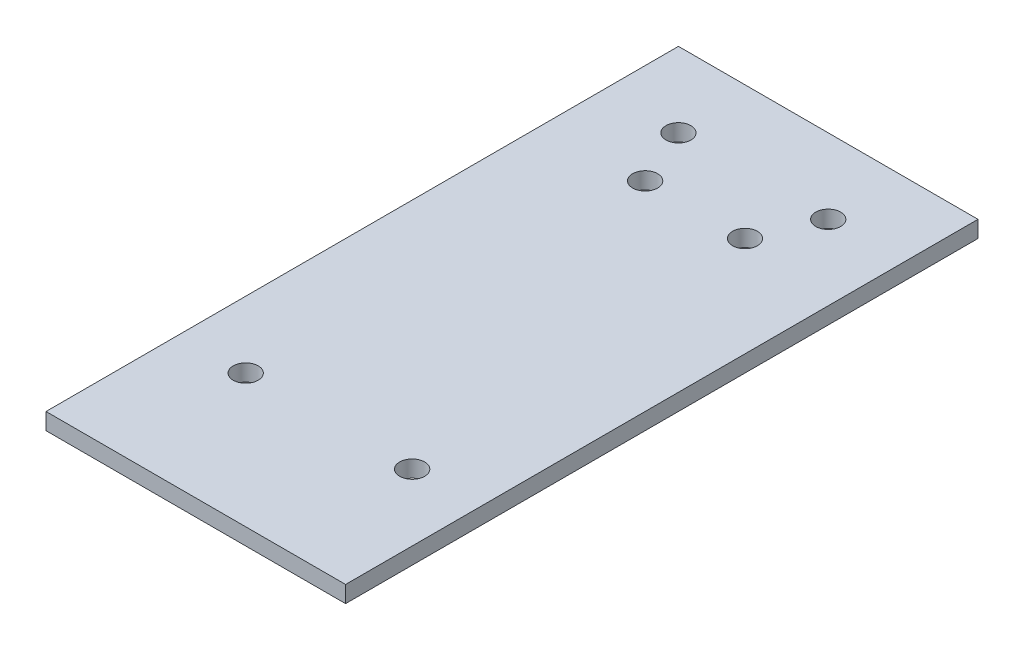
ISO-10303-21;
HEADER;
FILE_DESCRIPTION(('STEP AP214'),'2;1');
FILE_NAME('part.step','',(''),(''),'','','');
FILE_SCHEMA(('AUTOMOTIVE_DESIGN { 1 0 10303 214 1 1 1 1 }'));
ENDSEC;
DATA;
#1=APPLICATION_CONTEXT('core data for automotive mechanical design processes');
#2=APPLICATION_PROTOCOL_DEFINITION('international standard','automotive_design',2000,#1);
#3=PRODUCT_CONTEXT('',#1,'mechanical');
#4=PRODUCT('Part','Part','',(#3));
#5=PRODUCT_RELATED_PRODUCT_CATEGORY('part','',(#4));
#6=PRODUCT_DEFINITION_FORMATION('','',#4);
#7=PRODUCT_DEFINITION_CONTEXT('part definition',#1,'design');
#8=PRODUCT_DEFINITION('design','',#6,#7);
#9=PRODUCT_DEFINITION_SHAPE('','',#8);
#10=(LENGTH_UNIT() NAMED_UNIT(*) SI_UNIT(.MILLI.,.METRE.));
#11=(NAMED_UNIT(*) PLANE_ANGLE_UNIT() SI_UNIT($,.RADIAN.));
#12=(NAMED_UNIT(*) SI_UNIT($,.STERADIAN.) SOLID_ANGLE_UNIT());
#13=UNCERTAINTY_MEASURE_WITH_UNIT(LENGTH_MEASURE(1.E-05),#10,'distance_accuracy_value','');
#14=(GEOMETRIC_REPRESENTATION_CONTEXT(3) GLOBAL_UNCERTAINTY_ASSIGNED_CONTEXT((#13)) GLOBAL_UNIT_ASSIGNED_CONTEXT((#10,
#11,#12)) REPRESENTATION_CONTEXT('',''));
#15=CARTESIAN_POINT('',(0.,0.,0.));
#16=DIRECTION('',(0.,0.,1.));
#17=DIRECTION('',(1.,0.,0.));
#18=AXIS2_PLACEMENT_3D('',#15,#16,#17);
#19=CARTESIAN_POINT('',(-55.0011414435593,2.5,-245.185045950735));
#20=DIRECTION('',(0.,1.,0.));
#21=DIRECTION('',(0.,0.,1.));
#22=AXIS2_PLACEMENT_3D('',#19,#20,#21);
#23=PLANE('',#22);
#24=DIRECTION('',(1.,0.,0.));
#25=VECTOR('',#24,1.);
#26=CARTESIAN_POINT('',(0.,2.5,-225.));
#27=LINE('',#26,#25);
#28=CARTESIAN_POINT('',(-45.,2.5,-225.));
#29=VERTEX_POINT('',#28);
#30=CARTESIAN_POINT('',(45.,2.5,-225.));
#31=VERTEX_POINT('',#30);
#32=EDGE_CURVE('E94',#29,#31,#27,.T.);
#33=ORIENTED_EDGE('',*,*,#32,.F.);
#34=DIRECTION('',(0.,0.,1.));
#35=VECTOR('',#34,1.);
#36=CARTESIAN_POINT('',(-45.,2.5,-225.));
#37=LINE('',#36,#35);
#38=CARTESIAN_POINT('',(-45.,2.5,-35.));
#39=VERTEX_POINT('',#38);
#40=EDGE_CURVE('E90',#29,#39,#37,.T.);
#41=ORIENTED_EDGE('',*,*,#40,.T.);
#42=DIRECTION('',(1.,0.,0.));
#43=VECTOR('',#42,1.);
#44=CARTESIAN_POINT('',(0.,2.5,-35.));
#45=LINE('',#44,#43);
#46=CARTESIAN_POINT('',(45.,2.5,-35.));
#47=VERTEX_POINT('',#46);
#48=EDGE_CURVE('E92',#39,#47,#45,.T.);
#49=ORIENTED_EDGE('',*,*,#48,.T.);
#50=DIRECTION('',(0.,0.,-1.));
#51=VECTOR('',#50,1.);
#52=CARTESIAN_POINT('',(45.,2.5,-103.));
#53=LINE('',#52,#51);
#54=EDGE_CURVE('E98',#47,#31,#53,.T.);
#55=ORIENTED_EDGE('',*,*,#54,.T.);
#56=EDGE_LOOP('',(#33,#41,#49,#55));
#57=FACE_BOUND('',#56,.T.);
#58=CARTESIAN_POINT('',(-22.5,2.5,-202.5));
#59=DIRECTION('',(0.,1.,0.));
#60=DIRECTION('',(0.,0.,1.));
#61=AXIS2_PLACEMENT_3D('',#58,#59,#60);
#62=CIRCLE('',#61,3.75);
#63=CARTESIAN_POINT('',(-22.5,2.5,-198.75));
#64=VERTEX_POINT('',#63);
#65=EDGE_CURVE('E137',#64,#64,#62,.T.);
#66=ORIENTED_EDGE('',*,*,#65,.F.);
#67=EDGE_LOOP('',(#66));
#68=FACE_BOUND('',#67,.T.);
#69=CARTESIAN_POINT('',(-15.,2.5,-185.));
#70=DIRECTION('',(0.,1.,0.));
#71=DIRECTION('',(0.,0.,1.));
#72=AXIS2_PLACEMENT_3D('',#69,#70,#71);
#73=CIRCLE('',#72,3.75);
#74=CARTESIAN_POINT('',(-15.,2.5,-181.25));
#75=VERTEX_POINT('',#74);
#76=EDGE_CURVE('E145',#75,#75,#73,.T.);
#77=ORIENTED_EDGE('',*,*,#76,.F.);
#78=EDGE_LOOP('',(#77));
#79=FACE_BOUND('',#78,.T.);
#80=CARTESIAN_POINT('',(25.,2.5,-75.));
#81=DIRECTION('',(0.,1.,0.));
#82=DIRECTION('',(0.,0.,-1.));
#83=AXIS2_PLACEMENT_3D('',#80,#81,#82);
#84=CIRCLE('',#83,3.75);
#85=CARTESIAN_POINT('',(25.,2.5,-78.75));
#86=VERTEX_POINT('',#85);
#87=EDGE_CURVE('E153',#86,#86,#84,.T.);
#88=ORIENTED_EDGE('',*,*,#87,.F.);
#89=EDGE_LOOP('',(#88));
#90=FACE_BOUND('',#89,.T.);
#91=CARTESIAN_POINT('',(15.,2.5,-185.));
#92=DIRECTION('',(0.,1.,0.));
#93=DIRECTION('',(0.,0.,-1.));
#94=AXIS2_PLACEMENT_3D('',#91,#92,#93);
#95=CIRCLE('',#94,3.75);
#96=CARTESIAN_POINT('',(15.,2.5,-188.75));
#97=VERTEX_POINT('',#96);
#98=EDGE_CURVE('E161',#97,#97,#95,.T.);
#99=ORIENTED_EDGE('',*,*,#98,.F.);
#100=EDGE_LOOP('',(#99));
#101=FACE_BOUND('',#100,.T.);
#102=CARTESIAN_POINT('',(22.5,2.5,-202.5));
#103=DIRECTION('',(0.,1.,0.));
#104=DIRECTION('',(0.,0.,-1.));
#105=AXIS2_PLACEMENT_3D('',#102,#103,#104);
#106=CIRCLE('',#105,3.75);
#107=CARTESIAN_POINT('',(22.5,2.5,-206.25));
#108=VERTEX_POINT('',#107);
#109=EDGE_CURVE('E169',#108,#108,#106,.T.);
#110=ORIENTED_EDGE('',*,*,#109,.F.);
#111=EDGE_LOOP('',(#110));
#112=FACE_BOUND('',#111,.T.);
#113=CARTESIAN_POINT('',(-25.,2.5,-75.));
#114=DIRECTION('',(0.,1.,0.));
#115=DIRECTION('',(0.,0.,1.));
#116=AXIS2_PLACEMENT_3D('',#113,#114,#115);
#117=CIRCLE('',#116,3.75);
#118=CARTESIAN_POINT('',(-25.,2.5,-71.25));
#119=VERTEX_POINT('',#118);
#120=EDGE_CURVE('E134',#119,#119,#117,.T.);
#121=ORIENTED_EDGE('',*,*,#120,.F.);
#122=EDGE_LOOP('',(#121));
#123=FACE_BOUND('',#122,.T.);
#124=ADVANCED_FACE('F44',(#57,#68,#79,#90,#101,#112,#123),#23,.T.);
#125=CARTESIAN_POINT('',(-55.0011414435593,-2.5,-245.185045950735));
#126=DIRECTION('',(0.,1.,0.));
#127=DIRECTION('',(0.,0.,1.));
#128=AXIS2_PLACEMENT_3D('',#125,#126,#127);
#129=PLANE('',#128);
#130=CARTESIAN_POINT('',(-22.5,-2.5,-202.5));
#131=DIRECTION('',(0.,1.,0.));
#132=DIRECTION('',(0.,0.,1.));
#133=AXIS2_PLACEMENT_3D('',#130,#131,#132);
#134=CIRCLE('',#133,3.75);
#135=CARTESIAN_POINT('',(-22.5,-2.5,-198.75));
#136=VERTEX_POINT('',#135);
#137=EDGE_CURVE('E141',#136,#136,#134,.F.);
#138=ORIENTED_EDGE('',*,*,#137,.F.);
#139=EDGE_LOOP('',(#138));
#140=FACE_BOUND('',#139,.T.);
#141=CARTESIAN_POINT('',(-15.,-2.5,-185.));
#142=DIRECTION('',(0.,1.,0.));
#143=DIRECTION('',(0.,0.,1.));
#144=AXIS2_PLACEMENT_3D('',#141,#142,#143);
#145=CIRCLE('',#144,3.75);
#146=CARTESIAN_POINT('',(-15.,-2.5,-181.25));
#147=VERTEX_POINT('',#146);
#148=EDGE_CURVE('E149',#147,#147,#145,.F.);
#149=ORIENTED_EDGE('',*,*,#148,.F.);
#150=EDGE_LOOP('',(#149));
#151=FACE_BOUND('',#150,.T.);
#152=CARTESIAN_POINT('',(25.,-2.5,-75.));
#153=DIRECTION('',(0.,1.,0.));
#154=DIRECTION('',(0.,0.,1.));
#155=AXIS2_PLACEMENT_3D('',#152,#153,#154);
#156=CIRCLE('',#155,3.75);
#157=CARTESIAN_POINT('',(25.,-2.5,-71.25));
#158=VERTEX_POINT('',#157);
#159=EDGE_CURVE('E157',#158,#158,#156,.F.);
#160=ORIENTED_EDGE('',*,*,#159,.F.);
#161=EDGE_LOOP('',(#160));
#162=FACE_BOUND('',#161,.T.);
#163=CARTESIAN_POINT('',(15.,-2.5,-185.));
#164=DIRECTION('',(0.,1.,0.));
#165=DIRECTION('',(0.,0.,1.));
#166=AXIS2_PLACEMENT_3D('',#163,#164,#165);
#167=CIRCLE('',#166,3.75);
#168=CARTESIAN_POINT('',(15.,-2.5,-181.25));
#169=VERTEX_POINT('',#168);
#170=EDGE_CURVE('E165',#169,#169,#167,.F.);
#171=ORIENTED_EDGE('',*,*,#170,.F.);
#172=EDGE_LOOP('',(#171));
#173=FACE_BOUND('',#172,.T.);
#174=CARTESIAN_POINT('',(22.5,-2.5,-202.5));
#175=DIRECTION('',(0.,1.,0.));
#176=DIRECTION('',(0.,0.,1.));
#177=AXIS2_PLACEMENT_3D('',#174,#175,#176);
#178=CIRCLE('',#177,3.75);
#179=CARTESIAN_POINT('',(22.5,-2.5,-198.75));
#180=VERTEX_POINT('',#179);
#181=EDGE_CURVE('E105',#180,#180,#178,.F.);
#182=ORIENTED_EDGE('',*,*,#181,.F.);
#183=EDGE_LOOP('',(#182));
#184=FACE_BOUND('',#183,.T.);
#185=CARTESIAN_POINT('',(-25.,-2.5,-75.));
#186=DIRECTION('',(0.,1.,0.));
#187=DIRECTION('',(0.,0.,1.));
#188=AXIS2_PLACEMENT_3D('',#185,#186,#187);
#189=CIRCLE('',#188,3.75);
#190=CARTESIAN_POINT('',(-25.,-2.5,-71.25));
#191=VERTEX_POINT('',#190);
#192=EDGE_CURVE('E129',#191,#191,#189,.F.);
#193=ORIENTED_EDGE('',*,*,#192,.F.);
#194=EDGE_LOOP('',(#193));
#195=FACE_BOUND('',#194,.T.);
#196=DIRECTION('',(0.,0.,1.));
#197=VECTOR('',#196,1.);
#198=CARTESIAN_POINT('',(-45.,-2.5,-103.));
#199=LINE('',#198,#197);
#200=CARTESIAN_POINT('',(-45.,-2.5,-225.));
#201=VERTEX_POINT('',#200);
#202=CARTESIAN_POINT('',(-45.,-2.5,-35.));
#203=VERTEX_POINT('',#202);
#204=EDGE_CURVE('E108',#201,#203,#199,.T.);
#205=ORIENTED_EDGE('',*,*,#204,.F.);
#206=DIRECTION('',(1.,0.,0.));
#207=VECTOR('',#206,1.);
#208=CARTESIAN_POINT('',(-55.0011414435593,-2.5,-225.));
#209=LINE('',#208,#207);
#210=CARTESIAN_POINT('',(45.,-2.5,-225.));
#211=VERTEX_POINT('',#210);
#212=EDGE_CURVE('E11',#201,#211,#209,.T.);
#213=ORIENTED_EDGE('',*,*,#212,.T.);
#214=DIRECTION('',(0.,0.,-1.));
#215=VECTOR('',#214,1.);
#216=CARTESIAN_POINT('',(45.,-2.5,-225.));
#217=LINE('',#216,#215);
#218=CARTESIAN_POINT('',(45.,-2.5,-35.));
#219=VERTEX_POINT('',#218);
#220=EDGE_CURVE('E99',#219,#211,#217,.T.);
#221=ORIENTED_EDGE('',*,*,#220,.F.);
#222=DIRECTION('',(1.,0.,0.));
#223=VECTOR('',#222,1.);
#224=CARTESIAN_POINT('',(-55.0011414435592,-2.5,-35.));
#225=LINE('',#224,#223);
#226=EDGE_CURVE('E53',#203,#219,#225,.T.);
#227=ORIENTED_EDGE('',*,*,#226,.F.);
#228=EDGE_LOOP('',(#205,#213,#221,#227));
#229=FACE_BOUND('',#228,.T.);
#230=ADVANCED_FACE('F179',(#140,#151,#162,#173,#184,#195,#229),#129,.F.);
#231=CARTESIAN_POINT('',(-45.,2.5,-103.));
#232=DIRECTION('',(1.,0.,0.));
#233=DIRECTION('',(0.,0.,-1.));
#234=AXIS2_PLACEMENT_3D('',#231,#232,#233);
#235=PLANE('',#234);
#236=ORIENTED_EDGE('',*,*,#204,.T.);
#237=DIRECTION('',(0.,-1.,0.));
#238=VECTOR('',#237,1.);
#239=CARTESIAN_POINT('',(-45.,2.5,-35.));
#240=LINE('',#239,#238);
#241=EDGE_CURVE('E67',#39,#203,#240,.T.);
#242=ORIENTED_EDGE('',*,*,#241,.F.);
#243=ORIENTED_EDGE('',*,*,#40,.F.);
#244=DIRECTION('',(0.,-1.,0.));
#245=VECTOR('',#244,1.);
#246=CARTESIAN_POINT('',(-45.,2.5,-225.));
#247=LINE('',#246,#245);
#248=EDGE_CURVE('E110',#29,#201,#247,.T.);
#249=ORIENTED_EDGE('',*,*,#248,.T.);
#250=EDGE_LOOP('',(#236,#242,#243,#249));
#251=FACE_BOUND('',#250,.T.);
#252=ADVANCED_FACE('F46',(#251),#235,.F.);
#253=CARTESIAN_POINT('',(45.,2.5,-225.));
#254=DIRECTION('',(-1.,0.,0.));
#255=DIRECTION('',(0.,0.,1.));
#256=AXIS2_PLACEMENT_3D('',#253,#254,#255);
#257=PLANE('',#256);
#258=ORIENTED_EDGE('',*,*,#220,.T.);
#259=DIRECTION('',(0.,-1.,0.));
#260=VECTOR('',#259,1.);
#261=CARTESIAN_POINT('',(45.,2.5,-225.));
#262=LINE('',#261,#260);
#263=EDGE_CURVE('E60',#31,#211,#262,.T.);
#264=ORIENTED_EDGE('',*,*,#263,.F.);
#265=ORIENTED_EDGE('',*,*,#54,.F.);
#266=DIRECTION('',(0.,-1.,0.));
#267=VECTOR('',#266,1.);
#268=CARTESIAN_POINT('',(45.,2.5,-35.));
#269=LINE('',#268,#267);
#270=EDGE_CURVE('E103',#47,#219,#269,.T.);
#271=ORIENTED_EDGE('',*,*,#270,.T.);
#272=EDGE_LOOP('',(#258,#264,#265,#271));
#273=FACE_BOUND('',#272,.T.);
#274=ADVANCED_FACE('F121',(#273),#257,.F.);
#275=CARTESIAN_POINT('',(-25.,-13.1066017177982,-75.));
#276=DIRECTION('',(0.,1.,0.));
#277=DIRECTION('',(0.,0.,1.));
#278=AXIS2_PLACEMENT_3D('',#275,#276,#277);
#279=CYLINDRICAL_SURFACE('',#278,3.75);
#280=ORIENTED_EDGE('',*,*,#192,.T.);
#281=EDGE_LOOP('',(#280));
#282=FACE_BOUND('',#281,.T.);
#283=ORIENTED_EDGE('',*,*,#120,.T.);
#284=EDGE_LOOP('',(#283));
#285=FACE_BOUND('',#284,.T.);
#286=ADVANCED_FACE('F192',(#282,#285),#279,.F.);
#287=CARTESIAN_POINT('',(22.5,-13.1066017177982,-202.5));
#288=DIRECTION('',(0.,1.,0.));
#289=DIRECTION('',(0.,0.,1.));
#290=AXIS2_PLACEMENT_3D('',#287,#288,#289);
#291=CYLINDRICAL_SURFACE('',#290,3.75);
#292=ORIENTED_EDGE('',*,*,#181,.T.);
#293=EDGE_LOOP('',(#292));
#294=FACE_BOUND('',#293,.T.);
#295=ORIENTED_EDGE('',*,*,#109,.T.);
#296=EDGE_LOOP('',(#295));
#297=FACE_BOUND('',#296,.T.);
#298=ADVANCED_FACE('F197',(#294,#297),#291,.F.);
#299=CARTESIAN_POINT('',(15.,-13.1066017177982,-185.));
#300=DIRECTION('',(0.,1.,0.));
#301=DIRECTION('',(0.,0.,1.));
#302=AXIS2_PLACEMENT_3D('',#299,#300,#301);
#303=CYLINDRICAL_SURFACE('',#302,3.75);
#304=ORIENTED_EDGE('',*,*,#170,.T.);
#305=EDGE_LOOP('',(#304));
#306=FACE_BOUND('',#305,.T.);
#307=ORIENTED_EDGE('',*,*,#98,.T.);
#308=EDGE_LOOP('',(#307));
#309=FACE_BOUND('',#308,.T.);
#310=ADVANCED_FACE('F202',(#306,#309),#303,.F.);
#311=CARTESIAN_POINT('',(25.,-13.1066017177982,-75.));
#312=DIRECTION('',(0.,1.,0.));
#313=DIRECTION('',(0.,0.,1.));
#314=AXIS2_PLACEMENT_3D('',#311,#312,#313);
#315=CYLINDRICAL_SURFACE('',#314,3.75);
#316=ORIENTED_EDGE('',*,*,#159,.T.);
#317=EDGE_LOOP('',(#316));
#318=FACE_BOUND('',#317,.T.);
#319=ORIENTED_EDGE('',*,*,#87,.T.);
#320=EDGE_LOOP('',(#319));
#321=FACE_BOUND('',#320,.T.);
#322=ADVANCED_FACE('F209',(#318,#321),#315,.F.);
#323=CARTESIAN_POINT('',(-15.,-13.1066017177982,-185.));
#324=DIRECTION('',(0.,1.,0.));
#325=DIRECTION('',(0.,0.,1.));
#326=AXIS2_PLACEMENT_3D('',#323,#324,#325);
#327=CYLINDRICAL_SURFACE('',#326,3.75);
#328=ORIENTED_EDGE('',*,*,#148,.T.);
#329=EDGE_LOOP('',(#328));
#330=FACE_BOUND('',#329,.T.);
#331=ORIENTED_EDGE('',*,*,#76,.T.);
#332=EDGE_LOOP('',(#331));
#333=FACE_BOUND('',#332,.T.);
#334=ADVANCED_FACE('F213',(#330,#333),#327,.F.);
#335=CARTESIAN_POINT('',(-22.5,-13.1066017177982,-202.5));
#336=DIRECTION('',(0.,1.,0.));
#337=DIRECTION('',(0.,0.,1.));
#338=AXIS2_PLACEMENT_3D('',#335,#336,#337);
#339=CYLINDRICAL_SURFACE('',#338,3.75);
#340=ORIENTED_EDGE('',*,*,#137,.T.);
#341=EDGE_LOOP('',(#340));
#342=FACE_BOUND('',#341,.T.);
#343=ORIENTED_EDGE('',*,*,#65,.T.);
#344=EDGE_LOOP('',(#343));
#345=FACE_BOUND('',#344,.T.);
#346=ADVANCED_FACE('F217',(#342,#345),#339,.F.);
#347=CARTESIAN_POINT('',(0.,-7.5,-35.));
#348=DIRECTION('',(0.,0.,1.));
#349=DIRECTION('',(1.,0.,0.));
#350=AXIS2_PLACEMENT_3D('',#347,#348,#349);
#351=PLANE('',#350);
#352=ORIENTED_EDGE('',*,*,#241,.T.);
#353=ORIENTED_EDGE('',*,*,#226,.T.);
#354=ORIENTED_EDGE('',*,*,#270,.F.);
#355=ORIENTED_EDGE('',*,*,#48,.F.);
#356=EDGE_LOOP('',(#352,#353,#354,#355));
#357=FACE_BOUND('',#356,.T.);
#358=ADVANCED_FACE('F101',(#357),#351,.T.);
#359=CARTESIAN_POINT('',(0.,-7.5,-225.));
#360=DIRECTION('',(0.,0.,1.));
#361=DIRECTION('',(1.,0.,0.));
#362=AXIS2_PLACEMENT_3D('',#359,#360,#361);
#363=PLANE('',#362);
#364=ORIENTED_EDGE('',*,*,#32,.T.);
#365=ORIENTED_EDGE('',*,*,#263,.T.);
#366=ORIENTED_EDGE('',*,*,#212,.F.);
#367=ORIENTED_EDGE('',*,*,#248,.F.);
#368=EDGE_LOOP('',(#364,#365,#366,#367));
#369=FACE_BOUND('',#368,.T.);
#370=ADVANCED_FACE('F178',(#369),#363,.F.);
#371=CLOSED_SHELL('',(#124,#230,#252,#274,#286,#298,#310,#322,#334,#346,#358,#370));
#372=MANIFOLD_SOLID_BREP('B2',#371);
#373=ADVANCED_BREP_SHAPE_REPRESENTATION('',(#18,#372),#14);
#374=SHAPE_DEFINITION_REPRESENTATION(#9,#373);
ENDSEC;
END-ISO-10303-21;
